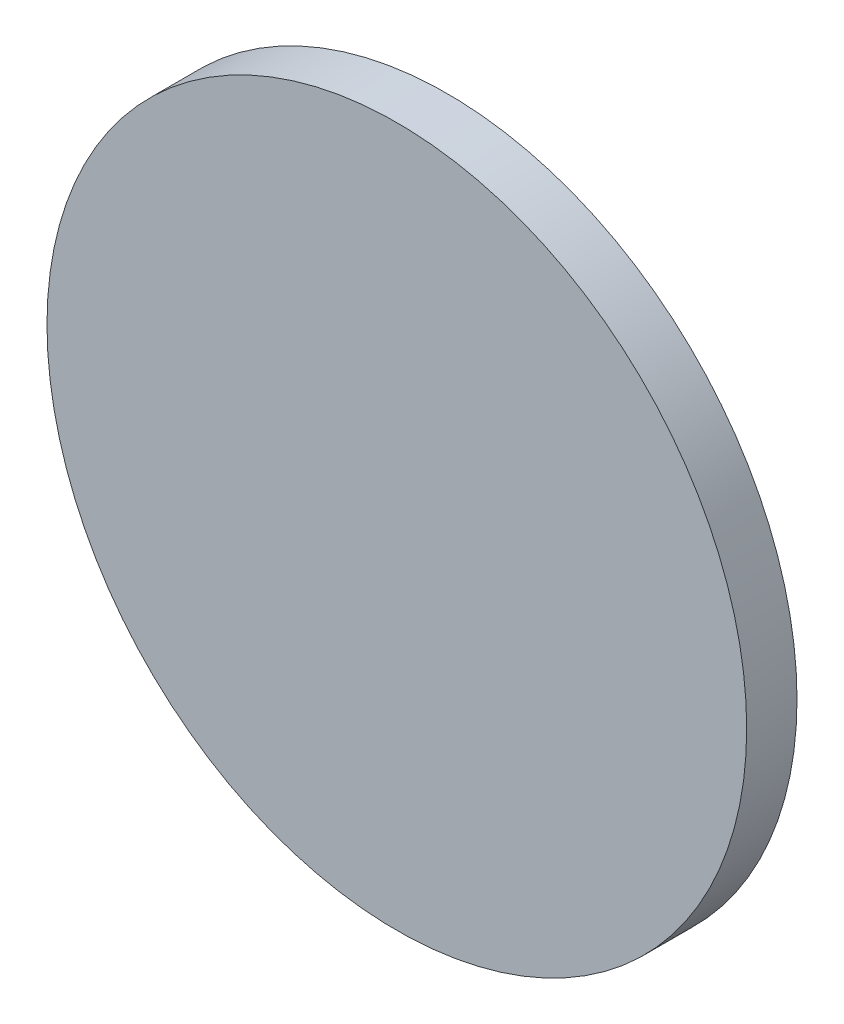
ISO-10303-21;
HEADER;
FILE_DESCRIPTION(('STEP AP214'),'2;1');
FILE_NAME('part.step','',(''),(''),'','','');
FILE_SCHEMA(('AUTOMOTIVE_DESIGN { 1 0 10303 214 1 1 1 1 }'));
ENDSEC;
DATA;
#1=APPLICATION_CONTEXT('core data for automotive mechanical design processes');
#2=APPLICATION_PROTOCOL_DEFINITION('international standard','automotive_design',2000,#1);
#3=PRODUCT_CONTEXT('',#1,'mechanical');
#4=PRODUCT('Part','Part','',(#3));
#5=PRODUCT_RELATED_PRODUCT_CATEGORY('part','',(#4));
#6=PRODUCT_DEFINITION_FORMATION('','',#4);
#7=PRODUCT_DEFINITION_CONTEXT('part definition',#1,'design');
#8=PRODUCT_DEFINITION('design','',#6,#7);
#9=PRODUCT_DEFINITION_SHAPE('','',#8);
#10=(LENGTH_UNIT() NAMED_UNIT(*) SI_UNIT(.MILLI.,.METRE.));
#11=(NAMED_UNIT(*) PLANE_ANGLE_UNIT() SI_UNIT($,.RADIAN.));
#12=(NAMED_UNIT(*) SI_UNIT($,.STERADIAN.) SOLID_ANGLE_UNIT());
#13=UNCERTAINTY_MEASURE_WITH_UNIT(LENGTH_MEASURE(1.E-05),#10,'distance_accuracy_value','');
#14=(GEOMETRIC_REPRESENTATION_CONTEXT(3) GLOBAL_UNCERTAINTY_ASSIGNED_CONTEXT((#13)) GLOBAL_UNIT_ASSIGNED_CONTEXT((#10,
#11,#12)) REPRESENTATION_CONTEXT('',''));
#15=CARTESIAN_POINT('',(0.,0.,0.));
#16=DIRECTION('',(0.,0.,1.));
#17=DIRECTION('',(1.,0.,0.));
#18=AXIS2_PLACEMENT_3D('',#15,#16,#17);
#19=CARTESIAN_POINT('',(0.,0.,5.5));
#20=DIRECTION('',(0.,0.,-1.));
#21=DIRECTION('',(-1.,0.,0.));
#22=AXIS2_PLACEMENT_3D('',#19,#20,#21);
#23=CYLINDRICAL_SURFACE('',#22,38.25);
#24=CARTESIAN_POINT('',(0.,0.,5.5));
#25=DIRECTION('',(0.,0.,1.));
#26=DIRECTION('',(1.,0.,0.));
#27=AXIS2_PLACEMENT_3D('',#24,#25,#26);
#28=CIRCLE('',#27,38.25);
#29=CARTESIAN_POINT('',(38.25,0.,5.5));
#30=VERTEX_POINT('',#29);
#31=EDGE_CURVE('E10',#30,#30,#28,.T.);
#32=ORIENTED_EDGE('',*,*,#31,.F.);
#33=EDGE_LOOP('',(#32));
#34=FACE_BOUND('',#33,.T.);
#35=CARTESIAN_POINT('',(0.,0.,0.));
#36=DIRECTION('',(0.,0.,1.));
#37=DIRECTION('',(1.,0.,0.));
#38=AXIS2_PLACEMENT_3D('',#35,#36,#37);
#39=CIRCLE('',#38,38.25);
#40=CARTESIAN_POINT('',(38.25,0.,0.));
#41=VERTEX_POINT('',#40);
#42=EDGE_CURVE('E44',#41,#41,#39,.T.);
#43=ORIENTED_EDGE('',*,*,#42,.T.);
#44=EDGE_LOOP('',(#43));
#45=FACE_BOUND('',#44,.T.);
#46=ADVANCED_FACE('F41',(#34,#45),#23,.T.);
#47=CARTESIAN_POINT('',(0.,0.,5.5));
#48=DIRECTION('',(0.,0.,1.));
#49=DIRECTION('',(1.,0.,0.));
#50=AXIS2_PLACEMENT_3D('',#47,#48,#49);
#51=PLANE('',#50);
#52=ORIENTED_EDGE('',*,*,#31,.T.);
#53=EDGE_LOOP('',(#52));
#54=FACE_BOUND('',#53,.T.);
#55=ADVANCED_FACE('F56',(#54),#51,.T.);
#56=CARTESIAN_POINT('',(0.,0.,0.));
#57=DIRECTION('',(0.,0.,1.));
#58=DIRECTION('',(1.,0.,0.));
#59=AXIS2_PLACEMENT_3D('',#56,#57,#58);
#60=PLANE('',#59);
#61=ORIENTED_EDGE('',*,*,#42,.F.);
#62=EDGE_LOOP('',(#61));
#63=FACE_BOUND('',#62,.T.);
#64=ADVANCED_FACE('F54',(#63),#60,.F.);
#65=CLOSED_SHELL('',(#46,#55,#64));
#66=MANIFOLD_SOLID_BREP('B2',#65);
#67=ADVANCED_BREP_SHAPE_REPRESENTATION('',(#18,#66),#14);
#68=SHAPE_DEFINITION_REPRESENTATION(#9,#67);
ENDSEC;
END-ISO-10303-21;
